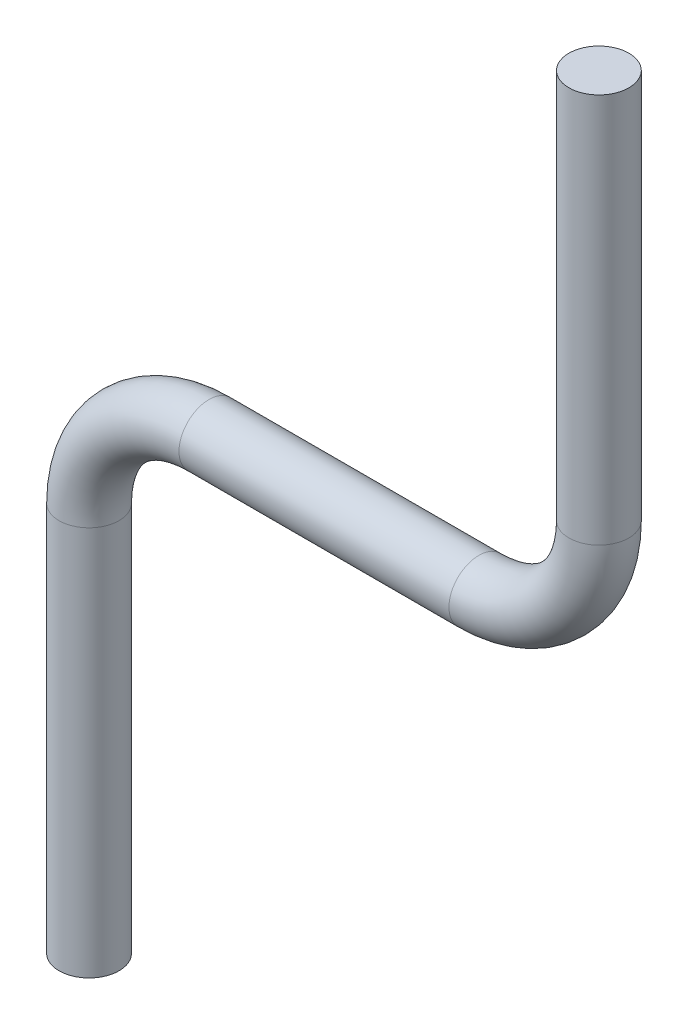
ISO-10303-21;
HEADER;
FILE_DESCRIPTION(('STEP AP214'),'2;1');
FILE_NAME('part.step','',(''),(''),'','','');
FILE_SCHEMA(('AUTOMOTIVE_DESIGN { 1 0 10303 214 1 1 1 1 }'));
ENDSEC;
DATA;
#1=APPLICATION_CONTEXT('core data for automotive mechanical design processes');
#2=APPLICATION_PROTOCOL_DEFINITION('international standard','automotive_design',2000,#1);
#3=PRODUCT_CONTEXT('',#1,'mechanical');
#4=PRODUCT('Part','Part','',(#3));
#5=PRODUCT_RELATED_PRODUCT_CATEGORY('part','',(#4));
#6=PRODUCT_DEFINITION_FORMATION('','',#4);
#7=PRODUCT_DEFINITION_CONTEXT('part definition',#1,'design');
#8=PRODUCT_DEFINITION('design','',#6,#7);
#9=PRODUCT_DEFINITION_SHAPE('','',#8);
#10=(LENGTH_UNIT() NAMED_UNIT(*) SI_UNIT(.MILLI.,.METRE.));
#11=(NAMED_UNIT(*) PLANE_ANGLE_UNIT() SI_UNIT($,.RADIAN.));
#12=(NAMED_UNIT(*) SI_UNIT($,.STERADIAN.) SOLID_ANGLE_UNIT());
#13=UNCERTAINTY_MEASURE_WITH_UNIT(LENGTH_MEASURE(1.E-05),#10,'distance_accuracy_value','');
#14=(GEOMETRIC_REPRESENTATION_CONTEXT(3) GLOBAL_UNCERTAINTY_ASSIGNED_CONTEXT((#13)) GLOBAL_UNIT_ASSIGNED_CONTEXT((#10,
#11,#12)) REPRESENTATION_CONTEXT('',''));
#15=CARTESIAN_POINT('',(0.,0.,0.));
#16=DIRECTION('',(0.,0.,1.));
#17=DIRECTION('',(1.,0.,0.));
#18=AXIS2_PLACEMENT_3D('',#15,#16,#17);
#19=CARTESIAN_POINT('',(0.,0.,0.));
#20=DIRECTION('',(0.,1.,0.));
#21=DIRECTION('',(0.,0.,1.));
#22=AXIS2_PLACEMENT_3D('',#19,#20,#21);
#23=PLANE('',#22);
#24=CARTESIAN_POINT('',(0.,0.,0.));
#25=DIRECTION('',(0.,1.,0.));
#26=DIRECTION('',(0.,0.,1.));
#27=AXIS2_PLACEMENT_3D('',#24,#25,#26);
#28=CIRCLE('',#27,2.);
#29=CARTESIAN_POINT('',(0.,0.,2.));
#30=VERTEX_POINT('',#29);
#31=EDGE_CURVE('E66',#30,#30,#28,.T.);
#32=ORIENTED_EDGE('',*,*,#31,.F.);
#33=EDGE_LOOP('',(#32));
#34=FACE_BOUND('',#33,.T.);
#35=ADVANCED_FACE('F39',(#34),#23,.F.);
#36=CARTESIAN_POINT('',(34.,68.,0.));
#37=DIRECTION('',(0.,1.,0.));
#38=DIRECTION('',(0.,0.,1.));
#39=AXIS2_PLACEMENT_3D('',#36,#37,#38);
#40=PLANE('',#39);
#41=CARTESIAN_POINT('',(34.,68.,0.));
#42=DIRECTION('',(0.,1.,0.));
#43=DIRECTION('',(0.,0.,1.));
#44=AXIS2_PLACEMENT_3D('',#41,#42,#43);
#45=CIRCLE('',#44,2.);
#46=CARTESIAN_POINT('',(34.,68.,2.));
#47=VERTEX_POINT('',#46);
#48=EDGE_CURVE('E10',#47,#47,#45,.T.);
#49=ORIENTED_EDGE('',*,*,#48,.T.);
#50=EDGE_LOOP('',(#49));
#51=FACE_BOUND('',#50,.T.);
#52=ADVANCED_FACE('F74',(#51),#40,.T.);
#53=CARTESIAN_POINT('',(0.,0.,0.));
#54=DIRECTION('',(0.,1.,0.));
#55=DIRECTION('',(0.,0.,1.));
#56=AXIS2_PLACEMENT_3D('',#53,#54,#55);
#57=CYLINDRICAL_SURFACE('',#56,2.);
#58=CARTESIAN_POINT('',(0.,25.9999999999999,0.));
#59=DIRECTION('',(0.,1.,0.));
#60=DIRECTION('',(0.,0.,1.));
#61=AXIS2_PLACEMENT_3D('',#58,#59,#60);
#62=CIRCLE('',#61,2.);
#63=CARTESIAN_POINT('',(-2.,25.9999999999999,0.));
#64=VERTEX_POINT('',#63);
#65=EDGE_CURVE('E62',#64,#64,#62,.T.);
#66=ORIENTED_EDGE('',*,*,#65,.F.);
#67=EDGE_LOOP('',(#66));
#68=FACE_BOUND('',#67,.T.);
#69=ORIENTED_EDGE('',*,*,#31,.T.);
#70=EDGE_LOOP('',(#69));
#71=FACE_BOUND('',#70,.T.);
#72=ADVANCED_FACE('F71',(#68,#71),#57,.T.);
#73=CARTESIAN_POINT('',(8.,26.,0.));
#74=DIRECTION('',(0.,0.,-1.));
#75=DIRECTION('',(-1.,0.,0.));
#76=AXIS2_PLACEMENT_3D('',#73,#74,#75);
#77=TOROIDAL_SURFACE('',#76,8.,2.);
#78=CARTESIAN_POINT('',(8.00000000000005,34.,0.));
#79=DIRECTION('',(1.,0.,0.));
#80=DIRECTION('',(0.,0.,1.));
#81=AXIS2_PLACEMENT_3D('',#78,#79,#80);
#82=CIRCLE('',#81,2.);
#83=CARTESIAN_POINT('',(8.00000000000007,36.,0.));
#84=VERTEX_POINT('',#83);
#85=EDGE_CURVE('E56',#84,#84,#82,.T.);
#86=CARTESIAN_POINT('',(8.,26.,0.));
#87=DIRECTION('',(0.,0.,-1.));
#88=DIRECTION('',(-1.,0.,0.));
#89=AXIS2_PLACEMENT_3D('',#86,#87,#88);
#90=CIRCLE('',#89,10.);
#91=EDGE_CURVE('',#64,#84,#90,.T.);
#92=ORIENTED_EDGE('',*,*,#65,.T.);
#93=ORIENTED_EDGE('',*,*,#85,.F.);
#94=ORIENTED_EDGE('',*,*,#91,.T.);
#95=ORIENTED_EDGE('',*,*,#91,.F.);
#96=EDGE_LOOP('',(#92,#94,#93,#95));
#97=FACE_BOUND('',#96,.T.);
#98=ADVANCED_FACE('F92',(#97),#77,.T.);
#99=CARTESIAN_POINT('',(8.00000000000006,34.,0.));
#100=DIRECTION('',(1.,0.,0.));
#101=DIRECTION('',(0.,0.,-1.));
#102=AXIS2_PLACEMENT_3D('',#99,#100,#101);
#103=CYLINDRICAL_SURFACE('',#102,2.);
#104=CARTESIAN_POINT('',(25.9999999999999,34.,0.));
#105=DIRECTION('',(1.,0.,0.));
#106=DIRECTION('',(0.,0.,1.));
#107=AXIS2_PLACEMENT_3D('',#104,#105,#106);
#108=CIRCLE('',#107,2.);
#109=CARTESIAN_POINT('',(25.9999999999999,32.,0.));
#110=VERTEX_POINT('',#109);
#111=EDGE_CURVE('E51',#110,#110,#108,.T.);
#112=ORIENTED_EDGE('',*,*,#111,.F.);
#113=EDGE_LOOP('',(#112));
#114=FACE_BOUND('',#113,.T.);
#115=ORIENTED_EDGE('',*,*,#85,.T.);
#116=EDGE_LOOP('',(#115));
#117=FACE_BOUND('',#116,.T.);
#118=ADVANCED_FACE('F86',(#114,#117),#103,.T.);
#119=CARTESIAN_POINT('',(26.,42.,0.));
#120=DIRECTION('',(0.,0.,1.));
#121=DIRECTION('',(1.,0.,0.));
#122=AXIS2_PLACEMENT_3D('',#119,#120,#121);
#123=TOROIDAL_SURFACE('',#122,8.,2.);
#124=CARTESIAN_POINT('',(34.,42.0000000000001,0.));
#125=DIRECTION('',(0.,1.,0.));
#126=DIRECTION('',(0.,0.,1.));
#127=AXIS2_PLACEMENT_3D('',#124,#125,#126);
#128=CIRCLE('',#127,2.);
#129=CARTESIAN_POINT('',(36.,42.0000000000001,0.));
#130=VERTEX_POINT('',#129);
#131=EDGE_CURVE('E46',#130,#130,#128,.T.);
#132=CARTESIAN_POINT('',(26.,42.,0.));
#133=DIRECTION('',(0.,0.,1.));
#134=DIRECTION('',(1.,0.,0.));
#135=AXIS2_PLACEMENT_3D('',#132,#133,#134);
#136=CIRCLE('',#135,10.);
#137=EDGE_CURVE('',#110,#130,#136,.T.);
#138=ORIENTED_EDGE('',*,*,#111,.T.);
#139=ORIENTED_EDGE('',*,*,#131,.F.);
#140=ORIENTED_EDGE('',*,*,#137,.T.);
#141=ORIENTED_EDGE('',*,*,#137,.F.);
#142=EDGE_LOOP('',(#138,#140,#139,#141));
#143=FACE_BOUND('',#142,.T.);
#144=ADVANCED_FACE('F80',(#143),#123,.T.);
#145=CARTESIAN_POINT('',(34.,42.0000000000001,0.));
#146=DIRECTION('',(0.,1.,0.));
#147=DIRECTION('',(0.,0.,1.));
#148=AXIS2_PLACEMENT_3D('',#145,#146,#147);
#149=CYLINDRICAL_SURFACE('',#148,2.);
#150=ORIENTED_EDGE('',*,*,#48,.F.);
#151=EDGE_LOOP('',(#150));
#152=FACE_BOUND('',#151,.T.);
#153=ORIENTED_EDGE('',*,*,#131,.T.);
#154=EDGE_LOOP('',(#153));
#155=FACE_BOUND('',#154,.T.);
#156=ADVANCED_FACE('F78',(#152,#155),#149,.T.);
#157=CLOSED_SHELL('',(#35,#52,#72,#98,#118,#144,#156));
#158=MANIFOLD_SOLID_BREP('B2',#157);
#159=ADVANCED_BREP_SHAPE_REPRESENTATION('',(#18,#158),#14);
#160=SHAPE_DEFINITION_REPRESENTATION(#9,#159);
ENDSEC;
END-ISO-10303-21;
